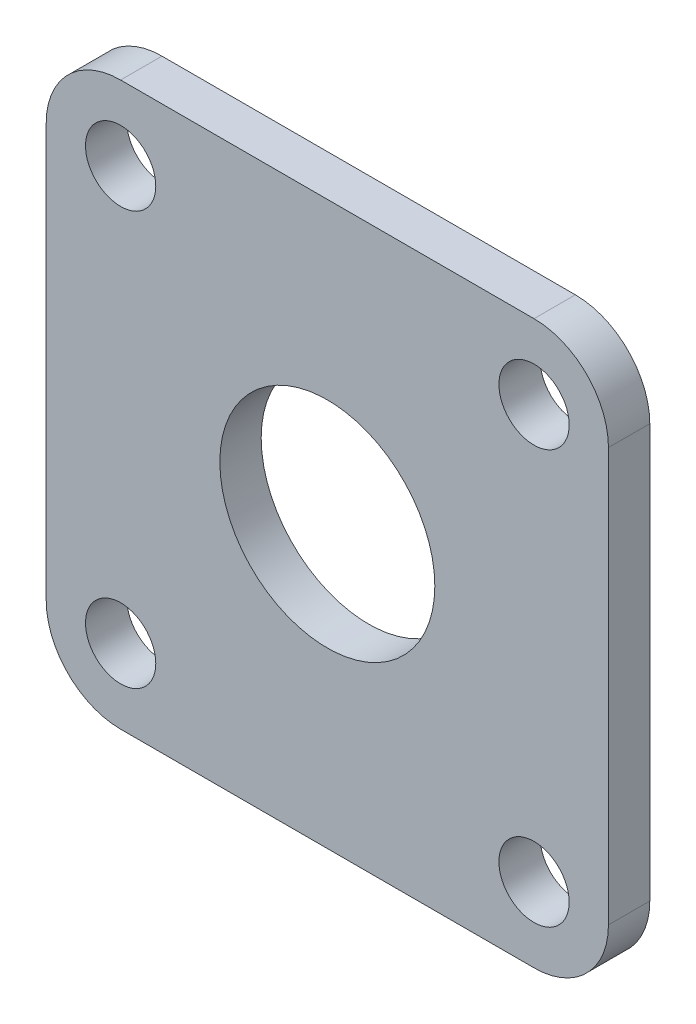
ISO-10303-21;
HEADER;
FILE_DESCRIPTION(('STEP AP214'),'2;1');
FILE_NAME('part.step','',(''),(''),'','','');
FILE_SCHEMA(('AUTOMOTIVE_DESIGN { 1 0 10303 214 1 1 1 1 }'));
ENDSEC;
DATA;
#1=APPLICATION_CONTEXT('core data for automotive mechanical design processes');
#2=APPLICATION_PROTOCOL_DEFINITION('international standard','automotive_design',2000,#1);
#3=PRODUCT_CONTEXT('',#1,'mechanical');
#4=PRODUCT('Part','Part','',(#3));
#5=PRODUCT_RELATED_PRODUCT_CATEGORY('part','',(#4));
#6=PRODUCT_DEFINITION_FORMATION('','',#4);
#7=PRODUCT_DEFINITION_CONTEXT('part definition',#1,'design');
#8=PRODUCT_DEFINITION('design','',#6,#7);
#9=PRODUCT_DEFINITION_SHAPE('','',#8);
#10=(LENGTH_UNIT() NAMED_UNIT(*) SI_UNIT(.MILLI.,.METRE.));
#11=(NAMED_UNIT(*) PLANE_ANGLE_UNIT() SI_UNIT($,.RADIAN.));
#12=(NAMED_UNIT(*) SI_UNIT($,.STERADIAN.) SOLID_ANGLE_UNIT());
#13=UNCERTAINTY_MEASURE_WITH_UNIT(LENGTH_MEASURE(1.E-05),#10,'distance_accuracy_value','');
#14=(GEOMETRIC_REPRESENTATION_CONTEXT(3) GLOBAL_UNCERTAINTY_ASSIGNED_CONTEXT((#13)) GLOBAL_UNIT_ASSIGNED_CONTEXT((#10,
#11,#12)) REPRESENTATION_CONTEXT('',''));
#15=CARTESIAN_POINT('',(0.,0.,0.));
#16=DIRECTION('',(0.,0.,1.));
#17=DIRECTION('',(1.,0.,0.));
#18=AXIS2_PLACEMENT_3D('',#15,#16,#17);
#19=CARTESIAN_POINT('',(25.,25.,5.));
#20=DIRECTION('',(0.,0.,-1.));
#21=DIRECTION('',(-1.,0.,0.));
#22=AXIS2_PLACEMENT_3D('',#19,#20,#21);
#23=PLANE('',#22);
#24=CARTESIAN_POINT('',(25.,25.,5.));
#25=DIRECTION('',(0.,0.,1.));
#26=DIRECTION('',(1.,0.,0.));
#27=AXIS2_PLACEMENT_3D('',#24,#25,#26);
#28=CIRCLE('',#27,4.25);
#29=CARTESIAN_POINT('',(29.25,25.,5.));
#30=VERTEX_POINT('',#29);
#31=EDGE_CURVE('E194',#30,#30,#28,.T.);
#32=ORIENTED_EDGE('',*,*,#31,.F.);
#33=EDGE_LOOP('',(#32));
#34=FACE_BOUND('',#33,.T.);
#35=CARTESIAN_POINT('',(-25.,-25.,5.));
#36=DIRECTION('',(0.,0.,1.));
#37=DIRECTION('',(1.,0.,0.));
#38=AXIS2_PLACEMENT_3D('',#35,#36,#37);
#39=CIRCLE('',#38,4.25);
#40=CARTESIAN_POINT('',(-20.75,-25.,5.));
#41=VERTEX_POINT('',#40);
#42=EDGE_CURVE('E182',#41,#41,#39,.T.);
#43=ORIENTED_EDGE('',*,*,#42,.F.);
#44=EDGE_LOOP('',(#43));
#45=FACE_BOUND('',#44,.T.);
#46=CARTESIAN_POINT('',(25.,25.,5.));
#47=DIRECTION('',(0.,0.,1.));
#48=DIRECTION('',(-1.,0.,0.));
#49=AXIS2_PLACEMENT_3D('',#46,#47,#48);
#50=CIRCLE('',#49,9.);
#51=CARTESIAN_POINT('',(34.,24.9999999999999,5.));
#52=VERTEX_POINT('',#51);
#53=CARTESIAN_POINT('',(24.9999999999999,34.,5.));
#54=VERTEX_POINT('',#53);
#55=EDGE_CURVE('E145',#52,#54,#50,.T.);
#56=ORIENTED_EDGE('',*,*,#55,.T.);
#57=DIRECTION('',(-1.,0.,0.));
#58=VECTOR('',#57,1.);
#59=CARTESIAN_POINT('',(24.9999999999999,34.,5.));
#60=LINE('',#59,#58);
#61=CARTESIAN_POINT('',(-25.,34.,5.));
#62=VERTEX_POINT('',#61);
#63=EDGE_CURVE('E93',#54,#62,#60,.T.);
#64=ORIENTED_EDGE('',*,*,#63,.T.);
#65=CARTESIAN_POINT('',(-25.,25.,5.));
#66=DIRECTION('',(0.,0.,1.));
#67=DIRECTION('',(-1.,0.,0.));
#68=AXIS2_PLACEMENT_3D('',#65,#66,#67);
#69=CIRCLE('',#68,9.);
#70=CARTESIAN_POINT('',(-34.,24.9999999999999,5.));
#71=VERTEX_POINT('',#70);
#72=EDGE_CURVE('E160',#62,#71,#69,.T.);
#73=ORIENTED_EDGE('',*,*,#72,.T.);
#74=DIRECTION('',(0.,-1.,0.));
#75=VECTOR('',#74,1.);
#76=CARTESIAN_POINT('',(-34.,24.9999999999999,5.));
#77=LINE('',#76,#75);
#78=CARTESIAN_POINT('',(-34.,-24.9999999999999,5.));
#79=VERTEX_POINT('',#78);
#80=EDGE_CURVE('E173',#71,#79,#77,.T.);
#81=ORIENTED_EDGE('',*,*,#80,.T.);
#82=CARTESIAN_POINT('',(-25.,-25.,5.));
#83=DIRECTION('',(0.,0.,1.));
#84=DIRECTION('',(-1.,0.,0.));
#85=AXIS2_PLACEMENT_3D('',#82,#83,#84);
#86=CIRCLE('',#85,9.);
#87=CARTESIAN_POINT('',(-24.9999999999999,-34.,5.));
#88=VERTEX_POINT('',#87);
#89=EDGE_CURVE('E112',#79,#88,#86,.T.);
#90=ORIENTED_EDGE('',*,*,#89,.T.);
#91=DIRECTION('',(1.,0.,0.));
#92=VECTOR('',#91,1.);
#93=CARTESIAN_POINT('',(24.9999999999999,-34.,5.));
#94=LINE('',#93,#92);
#95=CARTESIAN_POINT('',(24.9999999999999,-34.,5.));
#96=VERTEX_POINT('',#95);
#97=EDGE_CURVE('E106',#88,#96,#94,.T.);
#98=ORIENTED_EDGE('',*,*,#97,.T.);
#99=CARTESIAN_POINT('',(25.,-25.,5.));
#100=DIRECTION('',(0.,0.,1.));
#101=DIRECTION('',(-1.,0.,0.));
#102=AXIS2_PLACEMENT_3D('',#99,#100,#101);
#103=CIRCLE('',#102,9.);
#104=CARTESIAN_POINT('',(34.,-24.9999999999999,5.));
#105=VERTEX_POINT('',#104);
#106=EDGE_CURVE('E110',#96,#105,#103,.T.);
#107=ORIENTED_EDGE('',*,*,#106,.T.);
#108=DIRECTION('',(0.,1.,0.));
#109=VECTOR('',#108,1.);
#110=CARTESIAN_POINT('',(34.,24.9999999999999,5.));
#111=LINE('',#110,#109);
#112=EDGE_CURVE('E50',#105,#52,#111,.T.);
#113=ORIENTED_EDGE('',*,*,#112,.T.);
#114=EDGE_LOOP('',(#56,#64,#73,#81,#90,#98,#107,#113));
#115=FACE_BOUND('',#114,.T.);
#116=CARTESIAN_POINT('',(-25.,25.,5.));
#117=DIRECTION('',(0.,0.,1.));
#118=DIRECTION('',(1.,0.,0.));
#119=AXIS2_PLACEMENT_3D('',#116,#117,#118);
#120=CIRCLE('',#119,4.25);
#121=CARTESIAN_POINT('',(-20.75,25.,5.));
#122=VERTEX_POINT('',#121);
#123=EDGE_CURVE('E134',#122,#122,#120,.T.);
#124=ORIENTED_EDGE('',*,*,#123,.F.);
#125=EDGE_LOOP('',(#124));
#126=FACE_BOUND('',#125,.T.);
#127=CARTESIAN_POINT('',(25.,-25.,5.));
#128=DIRECTION('',(0.,0.,1.));
#129=DIRECTION('',(1.,0.,0.));
#130=AXIS2_PLACEMENT_3D('',#127,#128,#129);
#131=CIRCLE('',#130,4.25);
#132=CARTESIAN_POINT('',(29.25,-25.,5.));
#133=VERTEX_POINT('',#132);
#134=EDGE_CURVE('E188',#133,#133,#131,.T.);
#135=ORIENTED_EDGE('',*,*,#134,.F.);
#136=EDGE_LOOP('',(#135));
#137=FACE_BOUND('',#136,.T.);
#138=CARTESIAN_POINT('',(0.,0.,5.));
#139=DIRECTION('',(0.,0.,1.));
#140=DIRECTION('',(1.,0.,0.));
#141=AXIS2_PLACEMENT_3D('',#138,#139,#140);
#142=CIRCLE('',#141,13.);
#143=CARTESIAN_POINT('',(13.,0.,5.));
#144=VERTEX_POINT('',#143);
#145=EDGE_CURVE('E200',#144,#144,#142,.T.);
#146=ORIENTED_EDGE('',*,*,#145,.F.);
#147=EDGE_LOOP('',(#146));
#148=FACE_BOUND('',#147,.T.);
#149=ADVANCED_FACE('F33',(#34,#45,#115,#126,#137,#148),#23,.F.);
#150=CARTESIAN_POINT('',(25.,25.,0.));
#151=DIRECTION('',(0.,0.,-1.));
#152=DIRECTION('',(-1.,0.,0.));
#153=AXIS2_PLACEMENT_3D('',#150,#151,#152);
#154=PLANE('',#153);
#155=CARTESIAN_POINT('',(25.,25.,0.));
#156=DIRECTION('',(0.,0.,1.));
#157=DIRECTION('',(1.,0.,0.));
#158=AXIS2_PLACEMENT_3D('',#155,#156,#157);
#159=CIRCLE('',#158,4.25);
#160=CARTESIAN_POINT('',(29.25,25.,0.));
#161=VERTEX_POINT('',#160);
#162=EDGE_CURVE('E197',#161,#161,#159,.T.);
#163=ORIENTED_EDGE('',*,*,#162,.T.);
#164=EDGE_LOOP('',(#163));
#165=FACE_BOUND('',#164,.T.);
#166=CARTESIAN_POINT('',(-25.,-25.,0.));
#167=DIRECTION('',(0.,0.,1.));
#168=DIRECTION('',(1.,0.,0.));
#169=AXIS2_PLACEMENT_3D('',#166,#167,#168);
#170=CIRCLE('',#169,4.25);
#171=CARTESIAN_POINT('',(-20.75,-25.,0.));
#172=VERTEX_POINT('',#171);
#173=EDGE_CURVE('E185',#172,#172,#170,.T.);
#174=ORIENTED_EDGE('',*,*,#173,.T.);
#175=EDGE_LOOP('',(#174));
#176=FACE_BOUND('',#175,.T.);
#177=CARTESIAN_POINT('',(25.,25.,0.));
#178=DIRECTION('',(0.,0.,1.));
#179=DIRECTION('',(-1.,0.,0.));
#180=AXIS2_PLACEMENT_3D('',#177,#178,#179);
#181=CIRCLE('',#180,9.);
#182=CARTESIAN_POINT('',(34.,24.9999999999999,0.));
#183=VERTEX_POINT('',#182);
#184=CARTESIAN_POINT('',(24.9999999999999,34.,0.));
#185=VERTEX_POINT('',#184);
#186=EDGE_CURVE('E130',#183,#185,#181,.T.);
#187=ORIENTED_EDGE('',*,*,#186,.F.);
#188=DIRECTION('',(0.,1.,0.));
#189=VECTOR('',#188,1.);
#190=CARTESIAN_POINT('',(34.,24.9999999999999,0.));
#191=LINE('',#190,#189);
#192=CARTESIAN_POINT('',(34.,-24.9999999999999,0.));
#193=VERTEX_POINT('',#192);
#194=EDGE_CURVE('E85',#193,#183,#191,.T.);
#195=ORIENTED_EDGE('',*,*,#194,.F.);
#196=CARTESIAN_POINT('',(25.,-25.,0.));
#197=DIRECTION('',(0.,0.,1.));
#198=DIRECTION('',(-1.,0.,0.));
#199=AXIS2_PLACEMENT_3D('',#196,#197,#198);
#200=CIRCLE('',#199,9.);
#201=CARTESIAN_POINT('',(24.9999999999999,-34.,0.));
#202=VERTEX_POINT('',#201);
#203=EDGE_CURVE('E79',#202,#193,#200,.T.);
#204=ORIENTED_EDGE('',*,*,#203,.F.);
#205=DIRECTION('',(1.,0.,0.));
#206=VECTOR('',#205,1.);
#207=CARTESIAN_POINT('',(24.9999999999999,-34.,0.));
#208=LINE('',#207,#206);
#209=CARTESIAN_POINT('',(-24.9999999999999,-34.,0.));
#210=VERTEX_POINT('',#209);
#211=EDGE_CURVE('E120',#210,#202,#208,.T.);
#212=ORIENTED_EDGE('',*,*,#211,.F.);
#213=CARTESIAN_POINT('',(-25.,-25.,0.));
#214=DIRECTION('',(0.,0.,1.));
#215=DIRECTION('',(-1.,0.,0.));
#216=AXIS2_PLACEMENT_3D('',#213,#214,#215);
#217=CIRCLE('',#216,9.);
#218=CARTESIAN_POINT('',(-34.,-24.9999999999999,0.));
#219=VERTEX_POINT('',#218);
#220=EDGE_CURVE('E140',#219,#210,#217,.T.);
#221=ORIENTED_EDGE('',*,*,#220,.F.);
#222=DIRECTION('',(0.,-1.,0.));
#223=VECTOR('',#222,1.);
#224=CARTESIAN_POINT('',(-34.,24.9999999999999,0.));
#225=LINE('',#224,#223);
#226=CARTESIAN_POINT('',(-34.,24.9999999999999,0.));
#227=VERTEX_POINT('',#226);
#228=EDGE_CURVE('E138',#227,#219,#225,.T.);
#229=ORIENTED_EDGE('',*,*,#228,.F.);
#230=CARTESIAN_POINT('',(-25.,25.,0.));
#231=DIRECTION('',(0.,0.,1.));
#232=DIRECTION('',(-1.,0.,0.));
#233=AXIS2_PLACEMENT_3D('',#230,#231,#232);
#234=CIRCLE('',#233,9.);
#235=CARTESIAN_POINT('',(-25.,34.,0.));
#236=VERTEX_POINT('',#235);
#237=EDGE_CURVE('E136',#236,#227,#234,.T.);
#238=ORIENTED_EDGE('',*,*,#237,.F.);
#239=DIRECTION('',(-1.,0.,0.));
#240=VECTOR('',#239,1.);
#241=CARTESIAN_POINT('',(24.9999999999999,34.,0.));
#242=LINE('',#241,#240);
#243=EDGE_CURVE('E133',#185,#236,#242,.T.);
#244=ORIENTED_EDGE('',*,*,#243,.F.);
#245=EDGE_LOOP('',(#187,#195,#204,#212,#221,#229,#238,#244));
#246=FACE_BOUND('',#245,.T.);
#247=CARTESIAN_POINT('',(-25.,25.,0.));
#248=DIRECTION('',(0.,0.,1.));
#249=DIRECTION('',(1.,0.,0.));
#250=AXIS2_PLACEMENT_3D('',#247,#248,#249);
#251=CIRCLE('',#250,4.25);
#252=CARTESIAN_POINT('',(-20.75,25.,0.));
#253=VERTEX_POINT('',#252);
#254=EDGE_CURVE('E179',#253,#253,#251,.T.);
#255=ORIENTED_EDGE('',*,*,#254,.T.);
#256=EDGE_LOOP('',(#255));
#257=FACE_BOUND('',#256,.T.);
#258=CARTESIAN_POINT('',(25.,-25.,0.));
#259=DIRECTION('',(0.,0.,1.));
#260=DIRECTION('',(1.,0.,0.));
#261=AXIS2_PLACEMENT_3D('',#258,#259,#260);
#262=CIRCLE('',#261,4.25);
#263=CARTESIAN_POINT('',(29.25,-25.,0.));
#264=VERTEX_POINT('',#263);
#265=EDGE_CURVE('E191',#264,#264,#262,.T.);
#266=ORIENTED_EDGE('',*,*,#265,.T.);
#267=EDGE_LOOP('',(#266));
#268=FACE_BOUND('',#267,.T.);
#269=CARTESIAN_POINT('',(0.,0.,0.));
#270=DIRECTION('',(0.,0.,1.));
#271=DIRECTION('',(1.,0.,0.));
#272=AXIS2_PLACEMENT_3D('',#269,#270,#271);
#273=CIRCLE('',#272,13.);
#274=CARTESIAN_POINT('',(13.,0.,0.));
#275=VERTEX_POINT('',#274);
#276=EDGE_CURVE('E203',#275,#275,#273,.T.);
#277=ORIENTED_EDGE('',*,*,#276,.T.);
#278=EDGE_LOOP('',(#277));
#279=FACE_BOUND('',#278,.T.);
#280=ADVANCED_FACE('F164',(#165,#176,#246,#257,#268,#279),#154,.T.);
#281=CARTESIAN_POINT('',(25.,25.,5.));
#282=DIRECTION('',(0.,0.,-1.));
#283=DIRECTION('',(-1.,0.,0.));
#284=AXIS2_PLACEMENT_3D('',#281,#282,#283);
#285=CYLINDRICAL_SURFACE('',#284,9.);
#286=ORIENTED_EDGE('',*,*,#186,.T.);
#287=DIRECTION('',(0.,0.,-1.));
#288=VECTOR('',#287,1.);
#289=CARTESIAN_POINT('',(24.9999999999999,34.,5.));
#290=LINE('',#289,#288);
#291=EDGE_CURVE('E11',#54,#185,#290,.T.);
#292=ORIENTED_EDGE('',*,*,#291,.F.);
#293=ORIENTED_EDGE('',*,*,#55,.F.);
#294=DIRECTION('',(0.,0.,-1.));
#295=VECTOR('',#294,1.);
#296=CARTESIAN_POINT('',(34.,24.9999999999999,5.));
#297=LINE('',#296,#295);
#298=EDGE_CURVE('E126',#52,#183,#297,.T.);
#299=ORIENTED_EDGE('',*,*,#298,.T.);
#300=EDGE_LOOP('',(#286,#292,#293,#299));
#301=FACE_BOUND('',#300,.T.);
#302=ADVANCED_FACE('F35',(#301),#285,.T.);
#303=CARTESIAN_POINT('',(24.9999999999999,34.,5.));
#304=DIRECTION('',(0.,-1.,0.));
#305=DIRECTION('',(1.,0.,0.));
#306=AXIS2_PLACEMENT_3D('',#303,#304,#305);
#307=PLANE('',#306);
#308=ORIENTED_EDGE('',*,*,#243,.T.);
#309=DIRECTION('',(0.,0.,-1.));
#310=VECTOR('',#309,1.);
#311=CARTESIAN_POINT('',(-25.,34.,5.));
#312=LINE('',#311,#310);
#313=EDGE_CURVE('E42',#62,#236,#312,.T.);
#314=ORIENTED_EDGE('',*,*,#313,.F.);
#315=ORIENTED_EDGE('',*,*,#63,.F.);
#316=ORIENTED_EDGE('',*,*,#291,.T.);
#317=EDGE_LOOP('',(#308,#314,#315,#316));
#318=FACE_BOUND('',#317,.T.);
#319=ADVANCED_FACE('F238',(#318),#307,.F.);
#320=CARTESIAN_POINT('',(-25.,25.,5.));
#321=DIRECTION('',(0.,0.,-1.));
#322=DIRECTION('',(-1.,0.,0.));
#323=AXIS2_PLACEMENT_3D('',#320,#321,#322);
#324=CYLINDRICAL_SURFACE('',#323,9.);
#325=ORIENTED_EDGE('',*,*,#237,.T.);
#326=DIRECTION('',(0.,0.,-1.));
#327=VECTOR('',#326,1.);
#328=CARTESIAN_POINT('',(-34.,24.9999999999999,5.));
#329=LINE('',#328,#327);
#330=EDGE_CURVE('E152',#71,#227,#329,.T.);
#331=ORIENTED_EDGE('',*,*,#330,.F.);
#332=ORIENTED_EDGE('',*,*,#72,.F.);
#333=ORIENTED_EDGE('',*,*,#313,.T.);
#334=EDGE_LOOP('',(#325,#331,#332,#333));
#335=FACE_BOUND('',#334,.T.);
#336=ADVANCED_FACE('F158',(#335),#324,.T.);
#337=CARTESIAN_POINT('',(-34.,24.9999999999999,5.));
#338=DIRECTION('',(1.,0.,0.));
#339=DIRECTION('',(0.,1.,0.));
#340=AXIS2_PLACEMENT_3D('',#337,#338,#339);
#341=PLANE('',#340);
#342=ORIENTED_EDGE('',*,*,#228,.T.);
#343=DIRECTION('',(0.,0.,-1.));
#344=VECTOR('',#343,1.);
#345=CARTESIAN_POINT('',(-34.,-24.9999999999999,5.));
#346=LINE('',#345,#344);
#347=EDGE_CURVE('E149',#79,#219,#346,.T.);
#348=ORIENTED_EDGE('',*,*,#347,.F.);
#349=ORIENTED_EDGE('',*,*,#80,.F.);
#350=ORIENTED_EDGE('',*,*,#330,.T.);
#351=EDGE_LOOP('',(#342,#348,#349,#350));
#352=FACE_BOUND('',#351,.T.);
#353=ADVANCED_FACE('F169',(#352),#341,.F.);
#354=CARTESIAN_POINT('',(-25.,-25.,5.));
#355=DIRECTION('',(0.,0.,-1.));
#356=DIRECTION('',(-1.,0.,0.));
#357=AXIS2_PLACEMENT_3D('',#354,#355,#356);
#358=CYLINDRICAL_SURFACE('',#357,9.);
#359=ORIENTED_EDGE('',*,*,#220,.T.);
#360=DIRECTION('',(0.,0.,-1.));
#361=VECTOR('',#360,1.);
#362=CARTESIAN_POINT('',(-24.9999999999999,-34.,5.));
#363=LINE('',#362,#361);
#364=EDGE_CURVE('E121',#88,#210,#363,.T.);
#365=ORIENTED_EDGE('',*,*,#364,.F.);
#366=ORIENTED_EDGE('',*,*,#89,.F.);
#367=ORIENTED_EDGE('',*,*,#347,.T.);
#368=EDGE_LOOP('',(#359,#365,#366,#367));
#369=FACE_BOUND('',#368,.T.);
#370=ADVANCED_FACE('F172',(#369),#358,.T.);
#371=CARTESIAN_POINT('',(24.9999999999999,-34.,5.));
#372=DIRECTION('',(0.,1.,0.));
#373=DIRECTION('',(-1.,0.,0.));
#374=AXIS2_PLACEMENT_3D('',#371,#372,#373);
#375=PLANE('',#374);
#376=ORIENTED_EDGE('',*,*,#211,.T.);
#377=DIRECTION('',(0.,0.,-1.));
#378=VECTOR('',#377,1.);
#379=CARTESIAN_POINT('',(24.9999999999999,-34.,5.));
#380=LINE('',#379,#378);
#381=EDGE_CURVE('E117',#96,#202,#380,.T.);
#382=ORIENTED_EDGE('',*,*,#381,.F.);
#383=ORIENTED_EDGE('',*,*,#97,.F.);
#384=ORIENTED_EDGE('',*,*,#364,.T.);
#385=EDGE_LOOP('',(#376,#382,#383,#384));
#386=FACE_BOUND('',#385,.T.);
#387=ADVANCED_FACE('F118',(#386),#375,.F.);
#388=CARTESIAN_POINT('',(25.,-25.,5.));
#389=DIRECTION('',(0.,0.,-1.));
#390=DIRECTION('',(-1.,0.,0.));
#391=AXIS2_PLACEMENT_3D('',#388,#389,#390);
#392=CYLINDRICAL_SURFACE('',#391,9.);
#393=ORIENTED_EDGE('',*,*,#203,.T.);
#394=DIRECTION('',(0.,0.,-1.));
#395=VECTOR('',#394,1.);
#396=CARTESIAN_POINT('',(34.,-24.9999999999999,5.));
#397=LINE('',#396,#395);
#398=EDGE_CURVE('E122',#105,#193,#397,.T.);
#399=ORIENTED_EDGE('',*,*,#398,.F.);
#400=ORIENTED_EDGE('',*,*,#106,.F.);
#401=ORIENTED_EDGE('',*,*,#381,.T.);
#402=EDGE_LOOP('',(#393,#399,#400,#401));
#403=FACE_BOUND('',#402,.T.);
#404=ADVANCED_FACE('F124',(#403),#392,.T.);
#405=CARTESIAN_POINT('',(34.,24.9999999999999,5.));
#406=DIRECTION('',(-1.,0.,0.));
#407=DIRECTION('',(0.,-1.,0.));
#408=AXIS2_PLACEMENT_3D('',#405,#406,#407);
#409=PLANE('',#408);
#410=ORIENTED_EDGE('',*,*,#194,.T.);
#411=ORIENTED_EDGE('',*,*,#298,.F.);
#412=ORIENTED_EDGE('',*,*,#112,.F.);
#413=ORIENTED_EDGE('',*,*,#398,.T.);
#414=EDGE_LOOP('',(#410,#411,#412,#413));
#415=FACE_BOUND('',#414,.T.);
#416=ADVANCED_FACE('F226',(#415),#409,.F.);
#417=CARTESIAN_POINT('',(-25.,25.,5.));
#418=DIRECTION('',(0.,0.,-1.));
#419=DIRECTION('',(-1.,0.,0.));
#420=AXIS2_PLACEMENT_3D('',#417,#418,#419);
#421=CYLINDRICAL_SURFACE('',#420,4.25);
#422=ORIENTED_EDGE('',*,*,#123,.T.);
#423=EDGE_LOOP('',(#422));
#424=FACE_BOUND('',#423,.T.);
#425=ORIENTED_EDGE('',*,*,#254,.F.);
#426=EDGE_LOOP('',(#425));
#427=FACE_BOUND('',#426,.T.);
#428=ADVANCED_FACE('F223',(#424,#427),#421,.F.);
#429=CARTESIAN_POINT('',(-25.,-25.,5.));
#430=DIRECTION('',(0.,0.,-1.));
#431=DIRECTION('',(-1.,0.,0.));
#432=AXIS2_PLACEMENT_3D('',#429,#430,#431);
#433=CYLINDRICAL_SURFACE('',#432,4.25);
#434=ORIENTED_EDGE('',*,*,#42,.T.);
#435=EDGE_LOOP('',(#434));
#436=FACE_BOUND('',#435,.T.);
#437=ORIENTED_EDGE('',*,*,#173,.F.);
#438=EDGE_LOOP('',(#437));
#439=FACE_BOUND('',#438,.T.);
#440=ADVANCED_FACE('F302',(#436,#439),#433,.F.);
#441=CARTESIAN_POINT('',(25.,-25.,5.));
#442=DIRECTION('',(0.,0.,-1.));
#443=DIRECTION('',(-1.,0.,0.));
#444=AXIS2_PLACEMENT_3D('',#441,#442,#443);
#445=CYLINDRICAL_SURFACE('',#444,4.25);
#446=ORIENTED_EDGE('',*,*,#134,.T.);
#447=EDGE_LOOP('',(#446));
#448=FACE_BOUND('',#447,.T.);
#449=ORIENTED_EDGE('',*,*,#265,.F.);
#450=EDGE_LOOP('',(#449));
#451=FACE_BOUND('',#450,.T.);
#452=ADVANCED_FACE('F310',(#448,#451),#445,.F.);
#453=CARTESIAN_POINT('',(25.,25.,5.));
#454=DIRECTION('',(0.,0.,-1.));
#455=DIRECTION('',(-1.,0.,0.));
#456=AXIS2_PLACEMENT_3D('',#453,#454,#455);
#457=CYLINDRICAL_SURFACE('',#456,4.25);
#458=ORIENTED_EDGE('',*,*,#31,.T.);
#459=EDGE_LOOP('',(#458));
#460=FACE_BOUND('',#459,.T.);
#461=ORIENTED_EDGE('',*,*,#162,.F.);
#462=EDGE_LOOP('',(#461));
#463=FACE_BOUND('',#462,.T.);
#464=ADVANCED_FACE('F318',(#460,#463),#457,.F.);
#465=CARTESIAN_POINT('',(0.,0.,5.));
#466=DIRECTION('',(0.,0.,-1.));
#467=DIRECTION('',(-1.,0.,0.));
#468=AXIS2_PLACEMENT_3D('',#465,#466,#467);
#469=CYLINDRICAL_SURFACE('',#468,13.);
#470=ORIENTED_EDGE('',*,*,#145,.T.);
#471=EDGE_LOOP('',(#470));
#472=FACE_BOUND('',#471,.T.);
#473=ORIENTED_EDGE('',*,*,#276,.F.);
#474=EDGE_LOOP('',(#473));
#475=FACE_BOUND('',#474,.T.);
#476=ADVANCED_FACE('F209',(#472,#475),#469,.F.);
#477=CLOSED_SHELL('',(#149,#280,#302,#319,#336,#353,#370,#387,#404,#416,#428,#440,#452,#464,#476));
#478=MANIFOLD_SOLID_BREP('B2',#477);
#479=ADVANCED_BREP_SHAPE_REPRESENTATION('',(#18,#478),#14);
#480=SHAPE_DEFINITION_REPRESENTATION(#9,#479);
ENDSEC;
END-ISO-10303-21;
